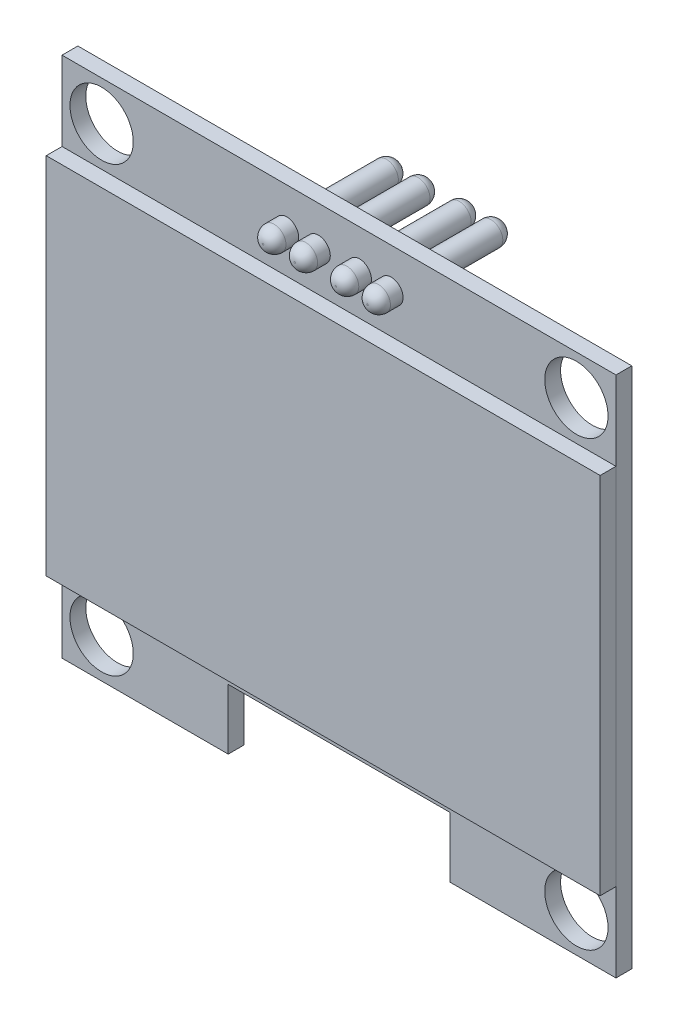
ISO-10303-21;
HEADER;
FILE_DESCRIPTION(('STEP AP214'),'2;1');
FILE_NAME('part.step','',(''),(''),'','','');
FILE_SCHEMA(('AUTOMOTIVE_DESIGN { 1 0 10303 214 1 1 1 1 }'));
ENDSEC;
DATA;
#1=APPLICATION_CONTEXT('core data for automotive mechanical design processes');
#2=APPLICATION_PROTOCOL_DEFINITION('international standard','automotive_design',2000,#1);
#3=PRODUCT_CONTEXT('',#1,'mechanical');
#4=PRODUCT('Part','Part','',(#3));
#5=PRODUCT_RELATED_PRODUCT_CATEGORY('part','',(#4));
#6=PRODUCT_DEFINITION_FORMATION('','',#4);
#7=PRODUCT_DEFINITION_CONTEXT('part definition',#1,'design');
#8=PRODUCT_DEFINITION('design','',#6,#7);
#9=PRODUCT_DEFINITION_SHAPE('','',#8);
#10=(LENGTH_UNIT() NAMED_UNIT(*) SI_UNIT(.MILLI.,.METRE.));
#11=(NAMED_UNIT(*) PLANE_ANGLE_UNIT() SI_UNIT($,.RADIAN.));
#12=(NAMED_UNIT(*) SI_UNIT($,.STERADIAN.) SOLID_ANGLE_UNIT());
#13=UNCERTAINTY_MEASURE_WITH_UNIT(LENGTH_MEASURE(1.E-05),#10,'distance_accuracy_value','');
#14=(GEOMETRIC_REPRESENTATION_CONTEXT(3) GLOBAL_UNCERTAINTY_ASSIGNED_CONTEXT((#13)) GLOBAL_UNIT_ASSIGNED_CONTEXT((#10,
#11,#12)) REPRESENTATION_CONTEXT('',''));
#15=CARTESIAN_POINT('',(0.,0.,0.));
#16=DIRECTION('',(0.,0.,1.));
#17=DIRECTION('',(1.,0.,0.));
#18=AXIS2_PLACEMENT_3D('',#15,#16,#17);
#19=CARTESIAN_POINT('',(-17.5,0.,2.));
#20=DIRECTION('',(1.,0.,0.));
#21=DIRECTION('',(0.,0.,-1.));
#22=AXIS2_PLACEMENT_3D('',#19,#20,#21);
#23=PLANE('',#22);
#24=DIRECTION('',(0.,-1.,0.));
#25=VECTOR('',#24,1.);
#26=CARTESIAN_POINT('',(-17.5,0.,1.));
#27=LINE('',#26,#25);
#28=CARTESIAN_POINT('',(-17.5,11.5,1.));
#29=VERTEX_POINT('',#28);
#30=CARTESIAN_POINT('',(-17.5,-11.5,1.));
#31=VERTEX_POINT('',#30);
#32=EDGE_CURVE('E110',#29,#31,#27,.T.);
#33=ORIENTED_EDGE('',*,*,#32,.T.);
#34=DIRECTION('',(0.,0.,-1.));
#35=VECTOR('',#34,1.);
#36=CARTESIAN_POINT('',(-17.5,-11.5,2.));
#37=LINE('',#36,#35);
#38=CARTESIAN_POINT('',(-17.5,-11.5,2.));
#39=VERTEX_POINT('',#38);
#40=EDGE_CURVE('E12',#39,#31,#37,.T.);
#41=ORIENTED_EDGE('',*,*,#40,.F.);
#42=DIRECTION('',(0.,-1.,0.));
#43=VECTOR('',#42,1.);
#44=CARTESIAN_POINT('',(-17.5,0.,2.));
#45=LINE('',#44,#43);
#46=CARTESIAN_POINT('',(-17.5,11.5,2.));
#47=VERTEX_POINT('',#46);
#48=EDGE_CURVE('E98',#47,#39,#45,.T.);
#49=ORIENTED_EDGE('',*,*,#48,.F.);
#50=DIRECTION('',(0.,0.,-1.));
#51=VECTOR('',#50,1.);
#52=CARTESIAN_POINT('',(-17.5,11.5,2.));
#53=LINE('',#52,#51);
#54=EDGE_CURVE('E106',#47,#29,#53,.T.);
#55=ORIENTED_EDGE('',*,*,#54,.T.);
#56=EDGE_LOOP('',(#33,#41,#49,#55));
#57=FACE_BOUND('',#56,.T.);
#58=ADVANCED_FACE('F47',(#57),#23,.F.);
#59=CARTESIAN_POINT('',(0.,-11.5,2.));
#60=DIRECTION('',(0.,1.,0.));
#61=DIRECTION('',(0.,0.,1.));
#62=AXIS2_PLACEMENT_3D('',#59,#60,#61);
#63=PLANE('',#62);
#64=DIRECTION('',(1.,0.,0.));
#65=VECTOR('',#64,1.);
#66=CARTESIAN_POINT('',(0.,-11.5,1.));
#67=LINE('',#66,#65);
#68=CARTESIAN_POINT('',(17.5,-11.5,1.));
#69=VERTEX_POINT('',#68);
#70=EDGE_CURVE('E102',#31,#69,#67,.T.);
#71=ORIENTED_EDGE('',*,*,#70,.T.);
#72=DIRECTION('',(0.,0.,-1.));
#73=VECTOR('',#72,1.);
#74=CARTESIAN_POINT('',(17.5,-11.5,2.));
#75=LINE('',#74,#73);
#76=CARTESIAN_POINT('',(17.5,-11.5,2.));
#77=VERTEX_POINT('',#76);
#78=EDGE_CURVE('E55',#77,#69,#75,.T.);
#79=ORIENTED_EDGE('',*,*,#78,.F.);
#80=DIRECTION('',(1.,0.,0.));
#81=VECTOR('',#80,1.);
#82=CARTESIAN_POINT('',(0.,-11.5,2.));
#83=LINE('',#82,#81);
#84=EDGE_CURVE('E93',#39,#77,#83,.T.);
#85=ORIENTED_EDGE('',*,*,#84,.F.);
#86=ORIENTED_EDGE('',*,*,#40,.T.);
#87=EDGE_LOOP('',(#71,#79,#85,#86));
#88=FACE_BOUND('',#87,.T.);
#89=ADVANCED_FACE('F101',(#88),#63,.F.);
#90=CARTESIAN_POINT('',(17.5,0.,2.));
#91=DIRECTION('',(-1.,0.,0.));
#92=DIRECTION('',(0.,0.,1.));
#93=AXIS2_PLACEMENT_3D('',#90,#91,#92);
#94=PLANE('',#93);
#95=DIRECTION('',(0.,1.,0.));
#96=VECTOR('',#95,1.);
#97=CARTESIAN_POINT('',(17.5,0.,1.));
#98=LINE('',#97,#96);
#99=CARTESIAN_POINT('',(17.5,11.5,1.));
#100=VERTEX_POINT('',#99);
#101=EDGE_CURVE('E80',#69,#100,#98,.T.);
#102=ORIENTED_EDGE('',*,*,#101,.T.);
#103=DIRECTION('',(0.,0.,-1.));
#104=VECTOR('',#103,1.);
#105=CARTESIAN_POINT('',(17.5,11.5,2.));
#106=LINE('',#105,#104);
#107=CARTESIAN_POINT('',(17.5,11.5,2.));
#108=VERTEX_POINT('',#107);
#109=EDGE_CURVE('E103',#108,#100,#106,.T.);
#110=ORIENTED_EDGE('',*,*,#109,.F.);
#111=DIRECTION('',(0.,1.,0.));
#112=VECTOR('',#111,1.);
#113=CARTESIAN_POINT('',(17.5,0.,2.));
#114=LINE('',#113,#112);
#115=EDGE_CURVE('E96',#77,#108,#114,.T.);
#116=ORIENTED_EDGE('',*,*,#115,.F.);
#117=ORIENTED_EDGE('',*,*,#78,.T.);
#118=EDGE_LOOP('',(#102,#110,#116,#117));
#119=FACE_BOUND('',#118,.T.);
#120=ADVANCED_FACE('F104',(#119),#94,.F.);
#121=CARTESIAN_POINT('',(0.,11.5,2.));
#122=DIRECTION('',(0.,-1.,0.));
#123=DIRECTION('',(0.,0.,-1.));
#124=AXIS2_PLACEMENT_3D('',#121,#122,#123);
#125=PLANE('',#124);
#126=DIRECTION('',(-1.,0.,0.));
#127=VECTOR('',#126,1.);
#128=CARTESIAN_POINT('',(0.,11.5,1.));
#129=LINE('',#128,#127);
#130=EDGE_CURVE('E86',#100,#29,#129,.T.);
#131=ORIENTED_EDGE('',*,*,#130,.T.);
#132=ORIENTED_EDGE('',*,*,#54,.F.);
#133=DIRECTION('',(-1.,0.,0.));
#134=VECTOR('',#133,1.);
#135=CARTESIAN_POINT('',(0.,11.5,2.));
#136=LINE('',#135,#134);
#137=EDGE_CURVE('E63',#108,#47,#136,.T.);
#138=ORIENTED_EDGE('',*,*,#137,.F.);
#139=ORIENTED_EDGE('',*,*,#109,.T.);
#140=EDGE_LOOP('',(#131,#132,#138,#139));
#141=FACE_BOUND('',#140,.T.);
#142=ADVANCED_FACE('F117',(#141),#125,.F.);
#143=CARTESIAN_POINT('',(0.,0.,2.));
#144=DIRECTION('',(0.,0.,1.));
#145=DIRECTION('',(1.,0.,0.));
#146=AXIS2_PLACEMENT_3D('',#143,#144,#145);
#147=PLANE('',#146);
#148=ORIENTED_EDGE('',*,*,#48,.T.);
#149=ORIENTED_EDGE('',*,*,#84,.T.);
#150=ORIENTED_EDGE('',*,*,#115,.T.);
#151=ORIENTED_EDGE('',*,*,#137,.T.);
#152=EDGE_LOOP('',(#148,#149,#150,#151));
#153=FACE_BOUND('',#152,.T.);
#154=ADVANCED_FACE('F94',(#153),#147,.T.);
#155=CARTESIAN_POINT('',(0.,0.,1.));
#156=DIRECTION('',(0.,0.,1.));
#157=DIRECTION('',(1.,0.,0.));
#158=AXIS2_PLACEMENT_3D('',#155,#156,#157);
#159=PLANE('',#158);
#160=ORIENTED_EDGE('',*,*,#32,.F.);
#161=ORIENTED_EDGE('',*,*,#130,.F.);
#162=ORIENTED_EDGE('',*,*,#101,.F.);
#163=ORIENTED_EDGE('',*,*,#70,.F.);
#164=EDGE_LOOP('',(#160,#161,#162,#163));
#165=FACE_BOUND('',#164,.T.);
#166=ADVANCED_FACE('F120',(#165),#159,.F.);
#167=CLOSED_SHELL('',(#58,#89,#120,#142,#154,#166));
#168=MANIFOLD_SOLID_BREP('B2',#167);
#169=CARTESIAN_POINT('',(0.,0.,1.));
#170=DIRECTION('',(0.,0.,-1.));
#171=DIRECTION('',(-1.,0.,0.));
#172=AXIS2_PLACEMENT_3D('',#169,#170,#171);
#173=PLANE('',#172);
#174=CARTESIAN_POINT('',(3.3,14.,1.));
#175=DIRECTION('',(0.,0.,-1.));
#176=DIRECTION('',(-1.,0.,0.));
#177=AXIS2_PLACEMENT_3D('',#174,#175,#176);
#178=CIRCLE('',#177,0.750000000000001);
#179=CARTESIAN_POINT('',(2.55,14.,1.));
#180=VERTEX_POINT('',#179);
#181=EDGE_CURVE('E576',#180,#180,#178,.T.);
#182=ORIENTED_EDGE('',*,*,#181,.T.);
#183=EDGE_LOOP('',(#182));
#184=FACE_BOUND('',#183,.T.);
#185=CARTESIAN_POINT('',(1.3,14.,1.));
#186=DIRECTION('',(0.,0.,-1.));
#187=DIRECTION('',(-1.,0.,0.));
#188=AXIS2_PLACEMENT_3D('',#185,#186,#187);
#189=CIRCLE('',#188,0.750000000000001);
#190=CARTESIAN_POINT('',(0.549999999999999,14.,1.));
#191=VERTEX_POINT('',#190);
#192=EDGE_CURVE('E573',#191,#191,#189,.T.);
#193=ORIENTED_EDGE('',*,*,#192,.T.);
#194=EDGE_LOOP('',(#193));
#195=FACE_BOUND('',#194,.T.);
#196=CARTESIAN_POINT('',(-3.3,14.,1.));
#197=DIRECTION('',(0.,0.,-1.));
#198=DIRECTION('',(-1.,0.,0.));
#199=AXIS2_PLACEMENT_3D('',#196,#197,#198);
#200=CIRCLE('',#199,0.750000000000001);
#201=CARTESIAN_POINT('',(-4.05,14.,1.));
#202=VERTEX_POINT('',#201);
#203=EDGE_CURVE('E561',#202,#202,#200,.T.);
#204=ORIENTED_EDGE('',*,*,#203,.T.);
#205=EDGE_LOOP('',(#204));
#206=FACE_BOUND('',#205,.T.);
#207=CARTESIAN_POINT('',(-1.3,14.,1.));
#208=DIRECTION('',(0.,0.,-1.));
#209=DIRECTION('',(-1.,0.,0.));
#210=AXIS2_PLACEMENT_3D('',#207,#208,#209);
#211=CIRCLE('',#210,0.750000000000001);
#212=CARTESIAN_POINT('',(-2.05,14.,1.));
#213=VERTEX_POINT('',#212);
#214=EDGE_CURVE('E556',#213,#213,#211,.T.);
#215=ORIENTED_EDGE('',*,*,#214,.T.);
#216=EDGE_LOOP('',(#215));
#217=FACE_BOUND('',#216,.T.);
#218=DIRECTION('',(0.,1.,0.));
#219=VECTOR('',#218,1.);
#220=CARTESIAN_POINT('',(17.5,-16.5,1.));
#221=LINE('',#220,#219);
#222=CARTESIAN_POINT('',(17.5,-16.5,1.));
#223=VERTEX_POINT('',#222);
#224=CARTESIAN_POINT('',(17.5,16.5,1.));
#225=VERTEX_POINT('',#224);
#226=EDGE_CURVE('E301',#223,#225,#221,.T.);
#227=ORIENTED_EDGE('',*,*,#226,.T.);
#228=DIRECTION('',(-1.,0.,0.));
#229=VECTOR('',#228,1.);
#230=CARTESIAN_POINT('',(-17.5,16.5,1.));
#231=LINE('',#230,#229);
#232=CARTESIAN_POINT('',(-17.5,16.5,1.));
#233=VERTEX_POINT('',#232);
#234=EDGE_CURVE('E249',#225,#233,#231,.T.);
#235=ORIENTED_EDGE('',*,*,#234,.T.);
#236=DIRECTION('',(0.,-1.,0.));
#237=VECTOR('',#236,1.);
#238=CARTESIAN_POINT('',(-17.5,-16.5,1.));
#239=LINE('',#238,#237);
#240=CARTESIAN_POINT('',(-17.5,-16.5,1.));
#241=VERTEX_POINT('',#240);
#242=EDGE_CURVE('E536',#233,#241,#239,.T.);
#243=ORIENTED_EDGE('',*,*,#242,.T.);
#244=DIRECTION('',(1.,0.,0.));
#245=VECTOR('',#244,1.);
#246=CARTESIAN_POINT('',(-17.5,-16.5,1.));
#247=LINE('',#246,#245);
#248=CARTESIAN_POINT('',(-7.,-16.5,1.));
#249=VERTEX_POINT('',#248);
#250=EDGE_CURVE('E538',#241,#249,#247,.T.);
#251=ORIENTED_EDGE('',*,*,#250,.T.);
#252=DIRECTION('',(0.,1.,0.));
#253=VECTOR('',#252,1.);
#254=CARTESIAN_POINT('',(-7.,-12.6830755399631,1.));
#255=LINE('',#254,#253);
#256=CARTESIAN_POINT('',(-7.,-12.6830755399631,1.));
#257=VERTEX_POINT('',#256);
#258=EDGE_CURVE('E268',#249,#257,#255,.T.);
#259=ORIENTED_EDGE('',*,*,#258,.T.);
#260=DIRECTION('',(1.,0.,0.));
#261=VECTOR('',#260,1.);
#262=CARTESIAN_POINT('',(-7.,-12.6830755399631,1.));
#263=LINE('',#262,#261);
#264=CARTESIAN_POINT('',(7.,-12.6830755399631,1.));
#265=VERTEX_POINT('',#264);
#266=EDGE_CURVE('E262',#257,#265,#263,.T.);
#267=ORIENTED_EDGE('',*,*,#266,.T.);
#268=DIRECTION('',(0.,-1.,0.));
#269=VECTOR('',#268,1.);
#270=CARTESIAN_POINT('',(7.,-12.6830755399631,1.));
#271=LINE('',#270,#269);
#272=CARTESIAN_POINT('',(7.,-16.5,1.));
#273=VERTEX_POINT('',#272);
#274=EDGE_CURVE('E266',#265,#273,#271,.T.);
#275=ORIENTED_EDGE('',*,*,#274,.T.);
#276=DIRECTION('',(1.,0.,0.));
#277=VECTOR('',#276,1.);
#278=CARTESIAN_POINT('',(7.,-16.5,1.));
#279=LINE('',#278,#277);
#280=EDGE_CURVE('E205',#273,#223,#279,.T.);
#281=ORIENTED_EDGE('',*,*,#280,.T.);
#282=EDGE_LOOP('',(#227,#235,#243,#251,#259,#267,#275,#281));
#283=FACE_BOUND('',#282,.T.);
#284=CARTESIAN_POINT('',(-15.,14.,1.));
#285=DIRECTION('',(0.,0.,1.));
#286=DIRECTION('',(1.,0.,0.));
#287=AXIS2_PLACEMENT_3D('',#284,#285,#286);
#288=CIRCLE('',#287,2.);
#289=CARTESIAN_POINT('',(-13.,14.,1.));
#290=VERTEX_POINT('',#289);
#291=EDGE_CURVE('E290',#290,#290,#288,.T.);
#292=ORIENTED_EDGE('',*,*,#291,.F.);
#293=EDGE_LOOP('',(#292));
#294=FACE_BOUND('',#293,.T.);
#295=CARTESIAN_POINT('',(15.,14.,1.));
#296=DIRECTION('',(0.,0.,1.));
#297=DIRECTION('',(-1.,0.,0.));
#298=AXIS2_PLACEMENT_3D('',#295,#296,#297);
#299=CIRCLE('',#298,2.);
#300=CARTESIAN_POINT('',(13.,14.,1.));
#301=VERTEX_POINT('',#300);
#302=EDGE_CURVE('E516',#301,#301,#299,.T.);
#303=ORIENTED_EDGE('',*,*,#302,.F.);
#304=EDGE_LOOP('',(#303));
#305=FACE_BOUND('',#304,.T.);
#306=CARTESIAN_POINT('',(15.,-14.,1.));
#307=DIRECTION('',(0.,0.,1.));
#308=DIRECTION('',(1.,0.,0.));
#309=AXIS2_PLACEMENT_3D('',#306,#307,#308);
#310=CIRCLE('',#309,2.);
#311=CARTESIAN_POINT('',(17.,-14.,1.));
#312=VERTEX_POINT('',#311);
#313=EDGE_CURVE('E521',#312,#312,#310,.T.);
#314=ORIENTED_EDGE('',*,*,#313,.F.);
#315=EDGE_LOOP('',(#314));
#316=FACE_BOUND('',#315,.T.);
#317=CARTESIAN_POINT('',(-15.,-14.,1.));
#318=DIRECTION('',(0.,0.,1.));
#319=DIRECTION('',(-1.,0.,0.));
#320=AXIS2_PLACEMENT_3D('',#317,#318,#319);
#321=CIRCLE('',#320,2.);
#322=CARTESIAN_POINT('',(-17.,-14.,1.));
#323=VERTEX_POINT('',#322);
#324=EDGE_CURVE('E555',#323,#323,#321,.T.);
#325=ORIENTED_EDGE('',*,*,#324,.F.);
#326=EDGE_LOOP('',(#325));
#327=FACE_BOUND('',#326,.T.);
#328=ADVANCED_FACE('F188',(#184,#195,#206,#217,#283,#294,#305,#316,#327),#173,.F.);
#329=CARTESIAN_POINT('',(0.,0.,0.));
#330=DIRECTION('',(0.,0.,-1.));
#331=DIRECTION('',(-1.,0.,0.));
#332=AXIS2_PLACEMENT_3D('',#329,#330,#331);
#333=PLANE('',#332);
#334=CARTESIAN_POINT('',(3.3,14.,0.));
#335=DIRECTION('',(0.,0.,-1.));
#336=DIRECTION('',(-1.,0.,0.));
#337=AXIS2_PLACEMENT_3D('',#334,#335,#336);
#338=CIRCLE('',#337,0.750000000000001);
#339=CARTESIAN_POINT('',(2.55,14.,0.));
#340=VERTEX_POINT('',#339);
#341=EDGE_CURVE('E325',#340,#340,#338,.T.);
#342=ORIENTED_EDGE('',*,*,#341,.F.);
#343=EDGE_LOOP('',(#342));
#344=FACE_BOUND('',#343,.T.);
#345=CARTESIAN_POINT('',(1.3,14.,0.));
#346=DIRECTION('',(0.,0.,-1.));
#347=DIRECTION('',(-1.,0.,0.));
#348=AXIS2_PLACEMENT_3D('',#345,#346,#347);
#349=CIRCLE('',#348,0.750000000000001);
#350=CARTESIAN_POINT('',(0.549999999999999,14.,0.));
#351=VERTEX_POINT('',#350);
#352=EDGE_CURVE('E322',#351,#351,#349,.T.);
#353=ORIENTED_EDGE('',*,*,#352,.F.);
#354=EDGE_LOOP('',(#353));
#355=FACE_BOUND('',#354,.T.);
#356=CARTESIAN_POINT('',(-3.3,14.,0.));
#357=DIRECTION('',(0.,0.,-1.));
#358=DIRECTION('',(-1.,0.,0.));
#359=AXIS2_PLACEMENT_3D('',#356,#357,#358);
#360=CIRCLE('',#359,0.750000000000001);
#361=CARTESIAN_POINT('',(-4.05,14.,0.));
#362=VERTEX_POINT('',#361);
#363=EDGE_CURVE('E319',#362,#362,#360,.T.);
#364=ORIENTED_EDGE('',*,*,#363,.F.);
#365=EDGE_LOOP('',(#364));
#366=FACE_BOUND('',#365,.T.);
#367=CARTESIAN_POINT('',(-1.3,14.,0.));
#368=DIRECTION('',(0.,0.,-1.));
#369=DIRECTION('',(-1.,0.,0.));
#370=AXIS2_PLACEMENT_3D('',#367,#368,#369);
#371=CIRCLE('',#370,0.750000000000001);
#372=CARTESIAN_POINT('',(-2.05,14.,0.));
#373=VERTEX_POINT('',#372);
#374=EDGE_CURVE('E316',#373,#373,#371,.T.);
#375=ORIENTED_EDGE('',*,*,#374,.F.);
#376=EDGE_LOOP('',(#375));
#377=FACE_BOUND('',#376,.T.);
#378=CARTESIAN_POINT('',(15.,-14.,0.));
#379=DIRECTION('',(0.,0.,1.));
#380=DIRECTION('',(1.,0.,0.));
#381=AXIS2_PLACEMENT_3D('',#378,#379,#380);
#382=CIRCLE('',#381,2.);
#383=CARTESIAN_POINT('',(17.,-14.,0.));
#384=VERTEX_POINT('',#383);
#385=EDGE_CURVE('E526',#384,#384,#382,.T.);
#386=ORIENTED_EDGE('',*,*,#385,.T.);
#387=EDGE_LOOP('',(#386));
#388=FACE_BOUND('',#387,.T.);
#389=CARTESIAN_POINT('',(-15.,14.,0.));
#390=DIRECTION('',(0.,0.,1.));
#391=DIRECTION('',(1.,0.,0.));
#392=AXIS2_PLACEMENT_3D('',#389,#390,#391);
#393=CIRCLE('',#392,2.);
#394=CARTESIAN_POINT('',(-13.,14.,0.));
#395=VERTEX_POINT('',#394);
#396=EDGE_CURVE('E523',#395,#395,#393,.T.);
#397=ORIENTED_EDGE('',*,*,#396,.T.);
#398=EDGE_LOOP('',(#397));
#399=FACE_BOUND('',#398,.T.);
#400=DIRECTION('',(0.,1.,0.));
#401=VECTOR('',#400,1.);
#402=CARTESIAN_POINT('',(17.5,-16.5,0.));
#403=LINE('',#402,#401);
#404=CARTESIAN_POINT('',(17.5,-16.5,0.));
#405=VERTEX_POINT('',#404);
#406=CARTESIAN_POINT('',(17.5,16.5,0.));
#407=VERTEX_POINT('',#406);
#408=EDGE_CURVE('E286',#405,#407,#403,.T.);
#409=ORIENTED_EDGE('',*,*,#408,.F.);
#410=DIRECTION('',(1.,0.,0.));
#411=VECTOR('',#410,1.);
#412=CARTESIAN_POINT('',(7.,-16.5,0.));
#413=LINE('',#412,#411);
#414=CARTESIAN_POINT('',(7.,-16.5,0.));
#415=VERTEX_POINT('',#414);
#416=EDGE_CURVE('E240',#415,#405,#413,.T.);
#417=ORIENTED_EDGE('',*,*,#416,.F.);
#418=DIRECTION('',(0.,-1.,0.));
#419=VECTOR('',#418,1.);
#420=CARTESIAN_POINT('',(7.,-12.6830755399631,0.));
#421=LINE('',#420,#419);
#422=CARTESIAN_POINT('',(7.,-12.6830755399631,0.));
#423=VERTEX_POINT('',#422);
#424=EDGE_CURVE('E234',#423,#415,#421,.T.);
#425=ORIENTED_EDGE('',*,*,#424,.F.);
#426=DIRECTION('',(1.,0.,0.));
#427=VECTOR('',#426,1.);
#428=CARTESIAN_POINT('',(-7.,-12.6830755399631,0.));
#429=LINE('',#428,#427);
#430=CARTESIAN_POINT('',(-7.,-12.6830755399631,0.));
#431=VERTEX_POINT('',#430);
#432=EDGE_CURVE('E276',#431,#423,#429,.T.);
#433=ORIENTED_EDGE('',*,*,#432,.F.);
#434=DIRECTION('',(0.,1.,0.));
#435=VECTOR('',#434,1.);
#436=CARTESIAN_POINT('',(-7.,-12.6830755399631,0.));
#437=LINE('',#436,#435);
#438=CARTESIAN_POINT('',(-7.,-16.5,0.));
#439=VERTEX_POINT('',#438);
#440=EDGE_CURVE('E296',#439,#431,#437,.T.);
#441=ORIENTED_EDGE('',*,*,#440,.F.);
#442=DIRECTION('',(1.,0.,0.));
#443=VECTOR('',#442,1.);
#444=CARTESIAN_POINT('',(-17.5,-16.5,0.));
#445=LINE('',#444,#443);
#446=CARTESIAN_POINT('',(-17.5,-16.5,0.));
#447=VERTEX_POINT('',#446);
#448=EDGE_CURVE('E294',#447,#439,#445,.T.);
#449=ORIENTED_EDGE('',*,*,#448,.F.);
#450=DIRECTION('',(0.,-1.,0.));
#451=VECTOR('',#450,1.);
#452=CARTESIAN_POINT('',(-17.5,-16.5,0.));
#453=LINE('',#452,#451);
#454=CARTESIAN_POINT('',(-17.5,16.5,0.));
#455=VERTEX_POINT('',#454);
#456=EDGE_CURVE('E292',#455,#447,#453,.T.);
#457=ORIENTED_EDGE('',*,*,#456,.F.);
#458=DIRECTION('',(-1.,0.,0.));
#459=VECTOR('',#458,1.);
#460=CARTESIAN_POINT('',(-17.5,16.5,0.));
#461=LINE('',#460,#459);
#462=EDGE_CURVE('E289',#407,#455,#461,.T.);
#463=ORIENTED_EDGE('',*,*,#462,.F.);
#464=EDGE_LOOP('',(#409,#417,#425,#433,#441,#449,#457,#463));
#465=FACE_BOUND('',#464,.T.);
#466=CARTESIAN_POINT('',(15.,14.,0.));
#467=DIRECTION('',(0.,0.,1.));
#468=DIRECTION('',(-1.,0.,0.));
#469=AXIS2_PLACEMENT_3D('',#466,#467,#468);
#470=CIRCLE('',#469,2.);
#471=CARTESIAN_POINT('',(13.,14.,0.));
#472=VERTEX_POINT('',#471);
#473=EDGE_CURVE('E519',#472,#472,#470,.T.);
#474=ORIENTED_EDGE('',*,*,#473,.T.);
#475=EDGE_LOOP('',(#474));
#476=FACE_BOUND('',#475,.T.);
#477=CARTESIAN_POINT('',(-15.,-14.,0.));
#478=DIRECTION('',(0.,0.,1.));
#479=DIRECTION('',(-1.,0.,0.));
#480=AXIS2_PLACEMENT_3D('',#477,#478,#479);
#481=CIRCLE('',#480,2.);
#482=CARTESIAN_POINT('',(-17.,-14.,0.));
#483=VERTEX_POINT('',#482);
#484=EDGE_CURVE('E553',#483,#483,#481,.T.);
#485=ORIENTED_EDGE('',*,*,#484,.T.);
#486=EDGE_LOOP('',(#485));
#487=FACE_BOUND('',#486,.T.);
#488=ADVANCED_FACE('F384',(#344,#355,#366,#377,#388,#399,#465,#476,#487),#333,.T.);
#489=CARTESIAN_POINT('',(17.5,-16.5,1.));
#490=DIRECTION('',(-1.,0.,0.));
#491=DIRECTION('',(0.,0.,1.));
#492=AXIS2_PLACEMENT_3D('',#489,#490,#491);
#493=PLANE('',#492);
#494=ORIENTED_EDGE('',*,*,#408,.T.);
#495=DIRECTION('',(0.,0.,-1.));
#496=VECTOR('',#495,1.);
#497=CARTESIAN_POINT('',(17.5,16.5,1.));
#498=LINE('',#497,#496);
#499=EDGE_CURVE('E314',#225,#407,#498,.T.);
#500=ORIENTED_EDGE('',*,*,#499,.F.);
#501=ORIENTED_EDGE('',*,*,#226,.F.);
#502=DIRECTION('',(0.,0.,-1.));
#503=VECTOR('',#502,1.);
#504=CARTESIAN_POINT('',(17.5,-16.5,1.));
#505=LINE('',#504,#503);
#506=EDGE_CURVE('E282',#223,#405,#505,.T.);
#507=ORIENTED_EDGE('',*,*,#506,.T.);
#508=EDGE_LOOP('',(#494,#500,#501,#507));
#509=FACE_BOUND('',#508,.T.);
#510=ADVANCED_FACE('F389',(#509),#493,.F.);
#511=CARTESIAN_POINT('',(-17.5,16.5,1.));
#512=DIRECTION('',(0.,-1.,0.));
#513=DIRECTION('',(0.,0.,-1.));
#514=AXIS2_PLACEMENT_3D('',#511,#512,#513);
#515=PLANE('',#514);
#516=ORIENTED_EDGE('',*,*,#462,.T.);
#517=DIRECTION('',(0.,0.,-1.));
#518=VECTOR('',#517,1.);
#519=CARTESIAN_POINT('',(-17.5,16.5,1.));
#520=LINE('',#519,#518);
#521=EDGE_CURVE('E311',#233,#455,#520,.T.);
#522=ORIENTED_EDGE('',*,*,#521,.F.);
#523=ORIENTED_EDGE('',*,*,#234,.F.);
#524=ORIENTED_EDGE('',*,*,#499,.T.);
#525=EDGE_LOOP('',(#516,#522,#523,#524));
#526=FACE_BOUND('',#525,.T.);
#527=ADVANCED_FACE('F416',(#526),#515,.F.);
#528=CARTESIAN_POINT('',(-17.5,-16.5,1.));
#529=DIRECTION('',(1.,0.,0.));
#530=DIRECTION('',(0.,0.,-1.));
#531=AXIS2_PLACEMENT_3D('',#528,#529,#530);
#532=PLANE('',#531);
#533=ORIENTED_EDGE('',*,*,#456,.T.);
#534=DIRECTION('',(0.,0.,-1.));
#535=VECTOR('',#534,1.);
#536=CARTESIAN_POINT('',(-17.5,-16.5,1.));
#537=LINE('',#536,#535);
#538=EDGE_CURVE('E308',#241,#447,#537,.T.);
#539=ORIENTED_EDGE('',*,*,#538,.F.);
#540=ORIENTED_EDGE('',*,*,#242,.F.);
#541=ORIENTED_EDGE('',*,*,#521,.T.);
#542=EDGE_LOOP('',(#533,#539,#540,#541));
#543=FACE_BOUND('',#542,.T.);
#544=ADVANCED_FACE('F412',(#543),#532,.F.);
#545=CARTESIAN_POINT('',(-17.5,-16.5,1.));
#546=DIRECTION('',(0.,1.,0.));
#547=DIRECTION('',(0.,0.,1.));
#548=AXIS2_PLACEMENT_3D('',#545,#546,#547);
#549=PLANE('',#548);
#550=ORIENTED_EDGE('',*,*,#448,.T.);
#551=DIRECTION('',(0.,0.,-1.));
#552=VECTOR('',#551,1.);
#553=CARTESIAN_POINT('',(-7.,-16.5,1.));
#554=LINE('',#553,#552);
#555=EDGE_CURVE('E305',#249,#439,#554,.T.);
#556=ORIENTED_EDGE('',*,*,#555,.F.);
#557=ORIENTED_EDGE('',*,*,#250,.F.);
#558=ORIENTED_EDGE('',*,*,#538,.T.);
#559=EDGE_LOOP('',(#550,#556,#557,#558));
#560=FACE_BOUND('',#559,.T.);
#561=ADVANCED_FACE('F408',(#560),#549,.F.);
#562=CARTESIAN_POINT('',(-7.,-12.6830755399631,1.));
#563=DIRECTION('',(-1.,0.,0.));
#564=DIRECTION('',(0.,0.,1.));
#565=AXIS2_PLACEMENT_3D('',#562,#563,#564);
#566=PLANE('',#565);
#567=ORIENTED_EDGE('',*,*,#440,.T.);
#568=DIRECTION('',(0.,0.,-1.));
#569=VECTOR('',#568,1.);
#570=CARTESIAN_POINT('',(-7.,-12.6830755399631,1.));
#571=LINE('',#570,#569);
#572=EDGE_CURVE('E277',#257,#431,#571,.T.);
#573=ORIENTED_EDGE('',*,*,#572,.F.);
#574=ORIENTED_EDGE('',*,*,#258,.F.);
#575=ORIENTED_EDGE('',*,*,#555,.T.);
#576=EDGE_LOOP('',(#567,#573,#574,#575));
#577=FACE_BOUND('',#576,.T.);
#578=ADVANCED_FACE('F405',(#577),#566,.F.);
#579=CARTESIAN_POINT('',(-7.,-12.6830755399631,1.));
#580=DIRECTION('',(0.,1.,0.));
#581=DIRECTION('',(0.,0.,1.));
#582=AXIS2_PLACEMENT_3D('',#579,#580,#581);
#583=PLANE('',#582);
#584=ORIENTED_EDGE('',*,*,#432,.T.);
#585=DIRECTION('',(0.,0.,-1.));
#586=VECTOR('',#585,1.);
#587=CARTESIAN_POINT('',(7.,-12.6830755399631,1.));
#588=LINE('',#587,#586);
#589=EDGE_CURVE('E273',#265,#423,#588,.T.);
#590=ORIENTED_EDGE('',*,*,#589,.F.);
#591=ORIENTED_EDGE('',*,*,#266,.F.);
#592=ORIENTED_EDGE('',*,*,#572,.T.);
#593=EDGE_LOOP('',(#584,#590,#591,#592));
#594=FACE_BOUND('',#593,.T.);
#595=ADVANCED_FACE('F274',(#594),#583,.F.);
#596=CARTESIAN_POINT('',(7.,-12.6830755399631,1.));
#597=DIRECTION('',(1.,0.,0.));
#598=DIRECTION('',(0.,0.,-1.));
#599=AXIS2_PLACEMENT_3D('',#596,#597,#598);
#600=PLANE('',#599);
#601=ORIENTED_EDGE('',*,*,#424,.T.);
#602=DIRECTION('',(0.,0.,-1.));
#603=VECTOR('',#602,1.);
#604=CARTESIAN_POINT('',(7.,-16.5,1.));
#605=LINE('',#604,#603);
#606=EDGE_CURVE('E278',#273,#415,#605,.T.);
#607=ORIENTED_EDGE('',*,*,#606,.F.);
#608=ORIENTED_EDGE('',*,*,#274,.F.);
#609=ORIENTED_EDGE('',*,*,#589,.T.);
#610=EDGE_LOOP('',(#601,#607,#608,#609));
#611=FACE_BOUND('',#610,.T.);
#612=ADVANCED_FACE('F280',(#611),#600,.F.);
#613=CARTESIAN_POINT('',(7.,-16.5,1.));
#614=DIRECTION('',(0.,1.,0.));
#615=DIRECTION('',(0.,0.,1.));
#616=AXIS2_PLACEMENT_3D('',#613,#614,#615);
#617=PLANE('',#616);
#618=ORIENTED_EDGE('',*,*,#416,.T.);
#619=ORIENTED_EDGE('',*,*,#506,.F.);
#620=ORIENTED_EDGE('',*,*,#280,.F.);
#621=ORIENTED_EDGE('',*,*,#606,.T.);
#622=EDGE_LOOP('',(#618,#619,#620,#621));
#623=FACE_BOUND('',#622,.T.);
#624=ADVANCED_FACE('F398',(#623),#617,.F.);
#625=CARTESIAN_POINT('',(-15.,14.,1.));
#626=DIRECTION('',(0.,0.,-1.));
#627=DIRECTION('',(-1.,0.,0.));
#628=AXIS2_PLACEMENT_3D('',#625,#626,#627);
#629=CYLINDRICAL_SURFACE('',#628,2.);
#630=ORIENTED_EDGE('',*,*,#291,.T.);
#631=EDGE_LOOP('',(#630));
#632=FACE_BOUND('',#631,.T.);
#633=ORIENTED_EDGE('',*,*,#396,.F.);
#634=EDGE_LOOP('',(#633));
#635=FACE_BOUND('',#634,.T.);
#636=ADVANCED_FACE('F395',(#632,#635),#629,.F.);
#637=CARTESIAN_POINT('',(15.,14.,1.));
#638=DIRECTION('',(0.,0.,-1.));
#639=DIRECTION('',(-1.,0.,0.));
#640=AXIS2_PLACEMENT_3D('',#637,#638,#639);
#641=CYLINDRICAL_SURFACE('',#640,2.);
#642=ORIENTED_EDGE('',*,*,#302,.T.);
#643=EDGE_LOOP('',(#642));
#644=FACE_BOUND('',#643,.T.);
#645=ORIENTED_EDGE('',*,*,#473,.F.);
#646=EDGE_LOOP('',(#645));
#647=FACE_BOUND('',#646,.T.);
#648=ADVANCED_FACE('F505',(#644,#647),#641,.F.);
#649=CARTESIAN_POINT('',(15.,-14.,1.));
#650=DIRECTION('',(0.,0.,-1.));
#651=DIRECTION('',(-1.,0.,0.));
#652=AXIS2_PLACEMENT_3D('',#649,#650,#651);
#653=CYLINDRICAL_SURFACE('',#652,2.);
#654=ORIENTED_EDGE('',*,*,#313,.T.);
#655=EDGE_LOOP('',(#654));
#656=FACE_BOUND('',#655,.T.);
#657=ORIENTED_EDGE('',*,*,#385,.F.);
#658=EDGE_LOOP('',(#657));
#659=FACE_BOUND('',#658,.T.);
#660=ADVANCED_FACE('F502',(#656,#659),#653,.F.);
#661=CARTESIAN_POINT('',(-15.,-14.,1.));
#662=DIRECTION('',(0.,0.,-1.));
#663=DIRECTION('',(-1.,0.,0.));
#664=AXIS2_PLACEMENT_3D('',#661,#662,#663);
#665=CYLINDRICAL_SURFACE('',#664,2.);
#666=ORIENTED_EDGE('',*,*,#324,.T.);
#667=EDGE_LOOP('',(#666));
#668=FACE_BOUND('',#667,.T.);
#669=ORIENTED_EDGE('',*,*,#484,.F.);
#670=EDGE_LOOP('',(#669));
#671=FACE_BOUND('',#670,.T.);
#672=ADVANCED_FACE('F495',(#668,#671),#665,.F.);
#673=CARTESIAN_POINT('',(-1.3,14.,-6.));
#674=DIRECTION('',(0.,0.,1.));
#675=DIRECTION('',(1.,0.,0.));
#676=AXIS2_PLACEMENT_3D('',#673,#674,#675);
#677=PLANE('',#676);
#678=CARTESIAN_POINT('',(-1.3,14.,-6.));
#679=DIRECTION('',(0.,0.,1.));
#680=DIRECTION('',(1.,0.,0.));
#681=AXIS2_PLACEMENT_3D('',#678,#679,#680);
#682=CIRCLE('',#681,0.0500000000000007);
#683=CARTESIAN_POINT('',(-1.25,14.,-6.));
#684=VERTEX_POINT('',#683);
#685=EDGE_CURVE('E343',#684,#684,#682,.F.);
#686=ORIENTED_EDGE('',*,*,#685,.T.);
#687=EDGE_LOOP('',(#686));
#688=FACE_BOUND('',#687,.T.);
#689=ADVANCED_FACE('F491',(#688),#677,.F.);
#690=CARTESIAN_POINT('',(-1.3,14.,-6.));
#691=DIRECTION('',(0.,0.,1.));
#692=DIRECTION('',(1.,0.,0.));
#693=AXIS2_PLACEMENT_3D('',#690,#691,#692);
#694=CYLINDRICAL_SURFACE('',#693,0.750000000000001);
#695=CARTESIAN_POINT('',(-1.3,14.,-5.3));
#696=DIRECTION('',(0.,0.,1.));
#697=DIRECTION('',(1.,0.,0.));
#698=AXIS2_PLACEMENT_3D('',#695,#696,#697);
#699=CIRCLE('',#698,0.750000000000001);
#700=CARTESIAN_POINT('',(-0.549999999999999,14.,-5.3));
#701=VERTEX_POINT('',#700);
#702=EDGE_CURVE('E340',#701,#701,#699,.T.);
#703=ORIENTED_EDGE('',*,*,#702,.T.);
#704=EDGE_LOOP('',(#703));
#705=FACE_BOUND('',#704,.T.);
#706=ORIENTED_EDGE('',*,*,#374,.T.);
#707=EDGE_LOOP('',(#706));
#708=FACE_BOUND('',#707,.T.);
#709=ADVANCED_FACE('F494',(#705,#708),#694,.T.);
#710=CARTESIAN_POINT('',(-1.3,14.,1.8));
#711=DIRECTION('',(0.,0.,1.));
#712=DIRECTION('',(1.,0.,0.));
#713=AXIS2_PLACEMENT_3D('',#710,#711,#712);
#714=CIRCLE('',#713,0.750000000000001);
#715=CARTESIAN_POINT('',(-0.549999999999999,14.,1.8));
#716=VERTEX_POINT('',#715);
#717=EDGE_CURVE('E367',#716,#716,#714,.F.);
#718=ORIENTED_EDGE('',*,*,#717,.T.);
#719=EDGE_LOOP('',(#718));
#720=FACE_BOUND('',#719,.T.);
#721=ORIENTED_EDGE('',*,*,#214,.F.);
#722=EDGE_LOOP('',(#721));
#723=FACE_BOUND('',#722,.T.);
#724=ADVANCED_FACE('F489',(#720,#723),#694,.T.);
#725=CARTESIAN_POINT('',(-1.3,14.,2.5));
#726=DIRECTION('',(0.,0.,1.));
#727=DIRECTION('',(1.,0.,0.));
#728=AXIS2_PLACEMENT_3D('',#725,#726,#727);
#729=PLANE('',#728);
#730=CARTESIAN_POINT('',(-1.3,14.,2.5));
#731=DIRECTION('',(0.,0.,1.));
#732=DIRECTION('',(1.,0.,0.));
#733=AXIS2_PLACEMENT_3D('',#730,#731,#732);
#734=CIRCLE('',#733,0.0500000000000007);
#735=CARTESIAN_POINT('',(-1.25,14.,2.5));
#736=VERTEX_POINT('',#735);
#737=EDGE_CURVE('E364',#736,#736,#734,.T.);
#738=ORIENTED_EDGE('',*,*,#737,.T.);
#739=EDGE_LOOP('',(#738));
#740=FACE_BOUND('',#739,.T.);
#741=ADVANCED_FACE('F482',(#740),#729,.T.);
#742=CARTESIAN_POINT('',(-3.3,14.,-6.));
#743=DIRECTION('',(0.,0.,1.));
#744=DIRECTION('',(1.,0.,0.));
#745=AXIS2_PLACEMENT_3D('',#742,#743,#744);
#746=PLANE('',#745);
#747=CARTESIAN_POINT('',(-3.3,14.,-6.));
#748=DIRECTION('',(0.,0.,1.));
#749=DIRECTION('',(1.,0.,0.));
#750=AXIS2_PLACEMENT_3D('',#747,#748,#749);
#751=CIRCLE('',#750,0.0500000000000007);
#752=CARTESIAN_POINT('',(-3.25,14.,-6.));
#753=VERTEX_POINT('',#752);
#754=EDGE_CURVE('E349',#753,#753,#751,.F.);
#755=ORIENTED_EDGE('',*,*,#754,.T.);
#756=EDGE_LOOP('',(#755));
#757=FACE_BOUND('',#756,.T.);
#758=ADVANCED_FACE('F478',(#757),#746,.F.);
#759=CARTESIAN_POINT('',(-3.3,14.,-6.));
#760=DIRECTION('',(0.,0.,1.));
#761=DIRECTION('',(1.,0.,0.));
#762=AXIS2_PLACEMENT_3D('',#759,#760,#761);
#763=CYLINDRICAL_SURFACE('',#762,0.750000000000001);
#764=CARTESIAN_POINT('',(-3.3,14.,-5.3));
#765=DIRECTION('',(0.,0.,1.));
#766=DIRECTION('',(1.,0.,0.));
#767=AXIS2_PLACEMENT_3D('',#764,#765,#766);
#768=CIRCLE('',#767,0.750000000000001);
#769=CARTESIAN_POINT('',(-2.55,14.,-5.3));
#770=VERTEX_POINT('',#769);
#771=EDGE_CURVE('E346',#770,#770,#768,.T.);
#772=ORIENTED_EDGE('',*,*,#771,.T.);
#773=EDGE_LOOP('',(#772));
#774=FACE_BOUND('',#773,.T.);
#775=ORIENTED_EDGE('',*,*,#363,.T.);
#776=EDGE_LOOP('',(#775));
#777=FACE_BOUND('',#776,.T.);
#778=ADVANCED_FACE('F481',(#774,#777),#763,.T.);
#779=CARTESIAN_POINT('',(-3.3,14.,1.8));
#780=DIRECTION('',(0.,0.,1.));
#781=DIRECTION('',(1.,0.,0.));
#782=AXIS2_PLACEMENT_3D('',#779,#780,#781);
#783=CIRCLE('',#782,0.750000000000001);
#784=CARTESIAN_POINT('',(-2.55,14.,1.8));
#785=VERTEX_POINT('',#784);
#786=EDGE_CURVE('E45',#785,#785,#783,.F.);
#787=ORIENTED_EDGE('',*,*,#786,.T.);
#788=EDGE_LOOP('',(#787));
#789=FACE_BOUND('',#788,.T.);
#790=ORIENTED_EDGE('',*,*,#203,.F.);
#791=EDGE_LOOP('',(#790));
#792=FACE_BOUND('',#791,.T.);
#793=ADVANCED_FACE('F477',(#789,#792),#763,.T.);
#794=CARTESIAN_POINT('',(-3.3,14.,2.5));
#795=DIRECTION('',(0.,0.,1.));
#796=DIRECTION('',(1.,0.,0.));
#797=AXIS2_PLACEMENT_3D('',#794,#795,#796);
#798=PLANE('',#797);
#799=CARTESIAN_POINT('',(-3.3,14.,2.5));
#800=DIRECTION('',(0.,0.,1.));
#801=DIRECTION('',(1.,0.,0.));
#802=AXIS2_PLACEMENT_3D('',#799,#800,#801);
#803=CIRCLE('',#802,0.0500000000000007);
#804=CARTESIAN_POINT('',(-3.25,14.,2.5));
#805=VERTEX_POINT('',#804);
#806=EDGE_CURVE('E197',#805,#805,#803,.T.);
#807=ORIENTED_EDGE('',*,*,#806,.T.);
#808=EDGE_LOOP('',(#807));
#809=FACE_BOUND('',#808,.T.);
#810=ADVANCED_FACE('F372',(#809),#798,.T.);
#811=CARTESIAN_POINT('',(1.3,14.,-6.));
#812=DIRECTION('',(0.,0.,-1.));
#813=DIRECTION('',(-1.,0.,0.));
#814=AXIS2_PLACEMENT_3D('',#811,#812,#813);
#815=PLANE('',#814);
#816=CARTESIAN_POINT('',(1.3,14.,-6.));
#817=DIRECTION('',(0.,0.,-1.));
#818=DIRECTION('',(-1.,0.,0.));
#819=AXIS2_PLACEMENT_3D('',#816,#817,#818);
#820=CIRCLE('',#819,0.0500000000000007);
#821=CARTESIAN_POINT('',(1.25,14.,-6.));
#822=VERTEX_POINT('',#821);
#823=EDGE_CURVE('E337',#822,#822,#820,.T.);
#824=ORIENTED_EDGE('',*,*,#823,.T.);
#825=EDGE_LOOP('',(#824));
#826=FACE_BOUND('',#825,.T.);
#827=ADVANCED_FACE('F469',(#826),#815,.T.);
#828=CARTESIAN_POINT('',(1.3,14.,-6.));
#829=DIRECTION('',(0.,0.,1.));
#830=DIRECTION('',(1.,0.,0.));
#831=AXIS2_PLACEMENT_3D('',#828,#829,#830);
#832=CYLINDRICAL_SURFACE('',#831,0.750000000000001);
#833=CARTESIAN_POINT('',(1.3,14.,-5.3));
#834=DIRECTION('',(0.,0.,-1.));
#835=DIRECTION('',(-1.,0.,0.));
#836=AXIS2_PLACEMENT_3D('',#833,#834,#835);
#837=CIRCLE('',#836,0.750000000000001);
#838=CARTESIAN_POINT('',(0.549999999999999,14.,-5.3));
#839=VERTEX_POINT('',#838);
#840=EDGE_CURVE('E334',#839,#839,#837,.F.);
#841=ORIENTED_EDGE('',*,*,#840,.T.);
#842=EDGE_LOOP('',(#841));
#843=FACE_BOUND('',#842,.T.);
#844=ORIENTED_EDGE('',*,*,#352,.T.);
#845=EDGE_LOOP('',(#844));
#846=FACE_BOUND('',#845,.T.);
#847=ADVANCED_FACE('F464',(#843,#846),#832,.T.);
#848=CARTESIAN_POINT('',(1.3,14.,1.8));
#849=DIRECTION('',(0.,0.,-1.));
#850=DIRECTION('',(-1.,0.,0.));
#851=AXIS2_PLACEMENT_3D('',#848,#849,#850);
#852=CIRCLE('',#851,0.750000000000001);
#853=CARTESIAN_POINT('',(0.549999999999999,14.,1.8));
#854=VERTEX_POINT('',#853);
#855=EDGE_CURVE('E361',#854,#854,#852,.T.);
#856=ORIENTED_EDGE('',*,*,#855,.T.);
#857=EDGE_LOOP('',(#856));
#858=FACE_BOUND('',#857,.T.);
#859=ORIENTED_EDGE('',*,*,#192,.F.);
#860=EDGE_LOOP('',(#859));
#861=FACE_BOUND('',#860,.T.);
#862=ADVANCED_FACE('F455',(#858,#861),#832,.T.);
#863=CARTESIAN_POINT('',(1.3,14.,2.5));
#864=DIRECTION('',(0.,0.,-1.));
#865=DIRECTION('',(-1.,0.,0.));
#866=AXIS2_PLACEMENT_3D('',#863,#864,#865);
#867=PLANE('',#866);
#868=CARTESIAN_POINT('',(1.3,14.,2.5));
#869=DIRECTION('',(0.,0.,-1.));
#870=DIRECTION('',(-1.,0.,0.));
#871=AXIS2_PLACEMENT_3D('',#868,#869,#870);
#872=CIRCLE('',#871,0.0500000000000007);
#873=CARTESIAN_POINT('',(1.25,14.,2.5));
#874=VERTEX_POINT('',#873);
#875=EDGE_CURVE('E358',#874,#874,#872,.F.);
#876=ORIENTED_EDGE('',*,*,#875,.T.);
#877=EDGE_LOOP('',(#876));
#878=FACE_BOUND('',#877,.T.);
#879=ADVANCED_FACE('F452',(#878),#867,.F.);
#880=CARTESIAN_POINT('',(3.3,14.,-6.));
#881=DIRECTION('',(0.,0.,-1.));
#882=DIRECTION('',(-1.,0.,0.));
#883=AXIS2_PLACEMENT_3D('',#880,#881,#882);
#884=PLANE('',#883);
#885=CARTESIAN_POINT('',(3.3,14.,-6.));
#886=DIRECTION('',(0.,0.,-1.));
#887=DIRECTION('',(-1.,0.,0.));
#888=AXIS2_PLACEMENT_3D('',#885,#886,#887);
#889=CIRCLE('',#888,0.0500000000000011);
#890=CARTESIAN_POINT('',(3.25,14.,-6.));
#891=VERTEX_POINT('',#890);
#892=EDGE_CURVE('E331',#891,#891,#889,.T.);
#893=ORIENTED_EDGE('',*,*,#892,.T.);
#894=EDGE_LOOP('',(#893));
#895=FACE_BOUND('',#894,.T.);
#896=ADVANCED_FACE('F454',(#895),#884,.T.);
#897=CARTESIAN_POINT('',(3.3,14.,-6.));
#898=DIRECTION('',(0.,0.,1.));
#899=DIRECTION('',(1.,0.,0.));
#900=AXIS2_PLACEMENT_3D('',#897,#898,#899);
#901=CYLINDRICAL_SURFACE('',#900,0.750000000000001);
#902=CARTESIAN_POINT('',(3.3,14.,-5.3));
#903=DIRECTION('',(0.,0.,-1.));
#904=DIRECTION('',(-1.,0.,0.));
#905=AXIS2_PLACEMENT_3D('',#902,#903,#904);
#906=CIRCLE('',#905,0.750000000000001);
#907=CARTESIAN_POINT('',(2.55,14.,-5.3));
#908=VERTEX_POINT('',#907);
#909=EDGE_CURVE('E328',#908,#908,#906,.F.);
#910=ORIENTED_EDGE('',*,*,#909,.T.);
#911=EDGE_LOOP('',(#910));
#912=FACE_BOUND('',#911,.T.);
#913=ORIENTED_EDGE('',*,*,#341,.T.);
#914=EDGE_LOOP('',(#913));
#915=FACE_BOUND('',#914,.T.);
#916=ADVANCED_FACE('F461',(#912,#915),#901,.T.);
#917=CARTESIAN_POINT('',(3.3,14.,1.8));
#918=DIRECTION('',(0.,0.,-1.));
#919=DIRECTION('',(-1.,0.,0.));
#920=AXIS2_PLACEMENT_3D('',#917,#918,#919);
#921=CIRCLE('',#920,0.750000000000001);
#922=CARTESIAN_POINT('',(2.55,14.,1.8));
#923=VERTEX_POINT('',#922);
#924=EDGE_CURVE('E355',#923,#923,#921,.T.);
#925=ORIENTED_EDGE('',*,*,#924,.T.);
#926=EDGE_LOOP('',(#925));
#927=FACE_BOUND('',#926,.T.);
#928=ORIENTED_EDGE('',*,*,#181,.F.);
#929=EDGE_LOOP('',(#928));
#930=FACE_BOUND('',#929,.T.);
#931=ADVANCED_FACE('F579',(#927,#930),#901,.T.);
#932=CARTESIAN_POINT('',(3.3,14.,2.5));
#933=DIRECTION('',(0.,0.,-1.));
#934=DIRECTION('',(-1.,0.,0.));
#935=AXIS2_PLACEMENT_3D('',#932,#933,#934);
#936=PLANE('',#935);
#937=CARTESIAN_POINT('',(3.3,14.,2.5));
#938=DIRECTION('',(0.,0.,-1.));
#939=DIRECTION('',(-1.,0.,0.));
#940=AXIS2_PLACEMENT_3D('',#937,#938,#939);
#941=CIRCLE('',#940,0.0500000000000011);
#942=CARTESIAN_POINT('',(3.25,14.,2.5));
#943=VERTEX_POINT('',#942);
#944=EDGE_CURVE('E352',#943,#943,#941,.F.);
#945=ORIENTED_EDGE('',*,*,#944,.T.);
#946=EDGE_LOOP('',(#945));
#947=FACE_BOUND('',#946,.T.);
#948=ADVANCED_FACE('F427',(#947),#936,.F.);
#949=CARTESIAN_POINT('',(3.3,14.,-5.3));
#950=DIRECTION('',(0.,0.,-1.));
#951=DIRECTION('',(-1.,0.,0.));
#952=AXIS2_PLACEMENT_3D('',#949,#950,#951);
#953=DEGENERATE_TOROIDAL_SURFACE('',#952,0.0500000000000011,0.7,.T.);
#954=ORIENTED_EDGE('',*,*,#892,.F.);
#955=EDGE_LOOP('',(#954));
#956=FACE_BOUND('',#955,.T.);
#957=ORIENTED_EDGE('',*,*,#909,.F.);
#958=EDGE_LOOP('',(#957));
#959=FACE_BOUND('',#958,.T.);
#960=ADVANCED_FACE('F423',(#956,#959),#953,.T.);
#961=CARTESIAN_POINT('',(1.3,14.,-5.3));
#962=DIRECTION('',(0.,0.,-1.));
#963=DIRECTION('',(-1.,0.,0.));
#964=AXIS2_PLACEMENT_3D('',#961,#962,#963);
#965=DEGENERATE_TOROIDAL_SURFACE('',#964,0.0500000000000007,0.7,.T.);
#966=ORIENTED_EDGE('',*,*,#823,.F.);
#967=EDGE_LOOP('',(#966));
#968=FACE_BOUND('',#967,.T.);
#969=ORIENTED_EDGE('',*,*,#840,.F.);
#970=EDGE_LOOP('',(#969));
#971=FACE_BOUND('',#970,.T.);
#972=ADVANCED_FACE('F426',(#968,#971),#965,.T.);
#973=CARTESIAN_POINT('',(-1.3,14.,-5.3));
#974=DIRECTION('',(0.,0.,1.));
#975=DIRECTION('',(1.,0.,0.));
#976=AXIS2_PLACEMENT_3D('',#973,#974,#975);
#977=DEGENERATE_TOROIDAL_SURFACE('',#976,0.0500000000000007,0.7,.T.);
#978=ORIENTED_EDGE('',*,*,#685,.F.);
#979=EDGE_LOOP('',(#978));
#980=FACE_BOUND('',#979,.T.);
#981=ORIENTED_EDGE('',*,*,#702,.F.);
#982=EDGE_LOOP('',(#981));
#983=FACE_BOUND('',#982,.T.);
#984=ADVANCED_FACE('F431',(#980,#983),#977,.T.);
#985=CARTESIAN_POINT('',(-3.3,14.,-5.3));
#986=DIRECTION('',(0.,0.,1.));
#987=DIRECTION('',(1.,0.,0.));
#988=AXIS2_PLACEMENT_3D('',#985,#986,#987);
#989=DEGENERATE_TOROIDAL_SURFACE('',#988,0.0500000000000007,0.7,.T.);
#990=ORIENTED_EDGE('',*,*,#754,.F.);
#991=EDGE_LOOP('',(#990));
#992=FACE_BOUND('',#991,.T.);
#993=ORIENTED_EDGE('',*,*,#771,.F.);
#994=EDGE_LOOP('',(#993));
#995=FACE_BOUND('',#994,.T.);
#996=ADVANCED_FACE('F435',(#992,#995),#989,.T.);
#997=CARTESIAN_POINT('',(3.3,14.,1.8));
#998=DIRECTION('',(0.,0.,-1.));
#999=DIRECTION('',(-1.,0.,0.));
#1000=AXIS2_PLACEMENT_3D('',#997,#998,#999);
#1001=DEGENERATE_TOROIDAL_SURFACE('',#1000,0.0500000000000011,0.7,.T.);
#1002=ORIENTED_EDGE('',*,*,#924,.F.);
#1003=EDGE_LOOP('',(#1002));
#1004=FACE_BOUND('',#1003,.T.);
#1005=ORIENTED_EDGE('',*,*,#944,.F.);
#1006=EDGE_LOOP('',(#1005));
#1007=FACE_BOUND('',#1006,.T.);
#1008=ADVANCED_FACE('F439',(#1004,#1007),#1001,.T.);
#1009=CARTESIAN_POINT('',(1.3,14.,1.8));
#1010=DIRECTION('',(0.,0.,-1.));
#1011=DIRECTION('',(-1.,0.,0.));
#1012=AXIS2_PLACEMENT_3D('',#1009,#1010,#1011);
#1013=DEGENERATE_TOROIDAL_SURFACE('',#1012,0.0500000000000007,0.7,.T.);
#1014=ORIENTED_EDGE('',*,*,#855,.F.);
#1015=EDGE_LOOP('',(#1014));
#1016=FACE_BOUND('',#1015,.T.);
#1017=ORIENTED_EDGE('',*,*,#875,.F.);
#1018=EDGE_LOOP('',(#1017));
#1019=FACE_BOUND('',#1018,.T.);
#1020=ADVANCED_FACE('F380',(#1016,#1019),#1013,.T.);
#1021=CARTESIAN_POINT('',(-1.3,14.,1.8));
#1022=DIRECTION('',(0.,0.,1.));
#1023=DIRECTION('',(1.,0.,0.));
#1024=AXIS2_PLACEMENT_3D('',#1021,#1022,#1023);
#1025=DEGENERATE_TOROIDAL_SURFACE('',#1024,0.0500000000000007,0.7,.T.);
#1026=ORIENTED_EDGE('',*,*,#717,.F.);
#1027=EDGE_LOOP('',(#1026));
#1028=FACE_BOUND('',#1027,.T.);
#1029=ORIENTED_EDGE('',*,*,#737,.F.);
#1030=EDGE_LOOP('',(#1029));
#1031=FACE_BOUND('',#1030,.T.);
#1032=ADVANCED_FACE('F375',(#1028,#1031),#1025,.T.);
#1033=CARTESIAN_POINT('',(-3.3,14.,1.8));
#1034=DIRECTION('',(0.,0.,1.));
#1035=DIRECTION('',(1.,0.,0.));
#1036=AXIS2_PLACEMENT_3D('',#1033,#1034,#1035);
#1037=DEGENERATE_TOROIDAL_SURFACE('',#1036,0.0500000000000007,0.7,.T.);
#1038=ORIENTED_EDGE('',*,*,#786,.F.);
#1039=EDGE_LOOP('',(#1038));
#1040=FACE_BOUND('',#1039,.T.);
#1041=ORIENTED_EDGE('',*,*,#806,.F.);
#1042=EDGE_LOOP('',(#1041));
#1043=FACE_BOUND('',#1042,.T.);
#1044=ADVANCED_FACE('F190',(#1040,#1043),#1037,.T.);
#1045=CLOSED_SHELL('',(#328,#488,#510,#527,#544,#561,#578,#595,#612,#624,#636,#648,#660,#672,
#689,#709,#724,#741,#758,#778,#793,#810,#827,#847,#862,#879,#896,#916,#931,#948,#960,#972,#984,
#996,#1008,#1020,#1032,#1044));
#1046=MANIFOLD_SOLID_BREP('B6',#1045);
#1047=ADVANCED_BREP_SHAPE_REPRESENTATION('',(#18,#168,#1046),#14);
#1048=SHAPE_DEFINITION_REPRESENTATION(#9,#1047);
ENDSEC;
END-ISO-10303-21;
